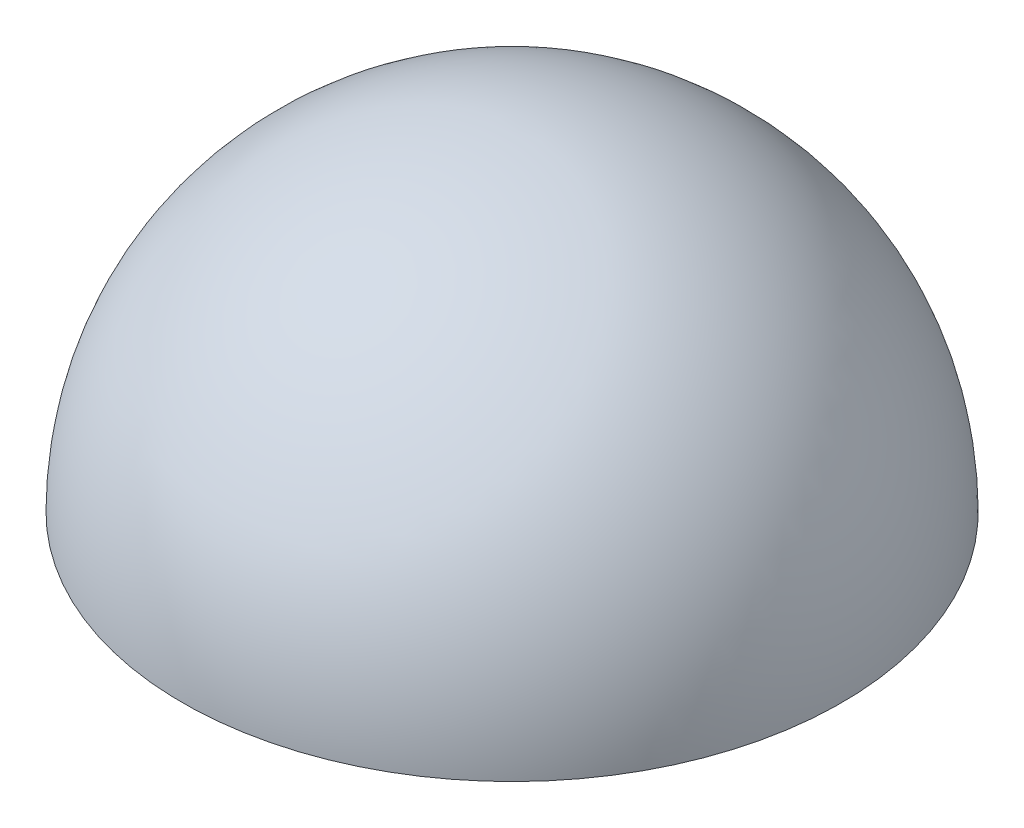
ISO-10303-21;
HEADER;
FILE_DESCRIPTION(('STEP AP214'),'2;1');
FILE_NAME('part.step','',(''),(''),'','','');
FILE_SCHEMA(('AUTOMOTIVE_DESIGN { 1 0 10303 214 1 1 1 1 }'));
ENDSEC;
DATA;
#1=APPLICATION_CONTEXT('core data for automotive mechanical design processes');
#2=APPLICATION_PROTOCOL_DEFINITION('international standard','automotive_design',2000,#1);
#3=PRODUCT_CONTEXT('',#1,'mechanical');
#4=PRODUCT('Part','Part','',(#3));
#5=PRODUCT_RELATED_PRODUCT_CATEGORY('part','',(#4));
#6=PRODUCT_DEFINITION_FORMATION('','',#4);
#7=PRODUCT_DEFINITION_CONTEXT('part definition',#1,'design');
#8=PRODUCT_DEFINITION('design','',#6,#7);
#9=PRODUCT_DEFINITION_SHAPE('','',#8);
#10=(LENGTH_UNIT() NAMED_UNIT(*) SI_UNIT(.MILLI.,.METRE.));
#11=(NAMED_UNIT(*) PLANE_ANGLE_UNIT() SI_UNIT($,.RADIAN.));
#12=(NAMED_UNIT(*) SI_UNIT($,.STERADIAN.) SOLID_ANGLE_UNIT());
#13=UNCERTAINTY_MEASURE_WITH_UNIT(LENGTH_MEASURE(1.E-05),#10,'distance_accuracy_value','');
#14=(GEOMETRIC_REPRESENTATION_CONTEXT(3) GLOBAL_UNCERTAINTY_ASSIGNED_CONTEXT((#13)) GLOBAL_UNIT_ASSIGNED_CONTEXT((#10,
#11,#12)) REPRESENTATION_CONTEXT('',''));
#15=CARTESIAN_POINT('',(0.,0.,0.));
#16=DIRECTION('',(0.,0.,1.));
#17=DIRECTION('',(1.,0.,0.));
#18=AXIS2_PLACEMENT_3D('',#15,#16,#17);
#19=CARTESIAN_POINT('',(0.,0.,0.));
#20=DIRECTION('',(-1.,0.,0.));
#21=DIRECTION('',(0.,0.,1.));
#22=AXIS2_PLACEMENT_3D('',#19,#20,#21);
#23=SPHERICAL_SURFACE('',#22,9.525);
#24=CARTESIAN_POINT('',(0.,0.,0.));
#25=DIRECTION('',(0.,-1.,0.));
#26=DIRECTION('',(0.,0.,-1.));
#27=AXIS2_PLACEMENT_3D('',#24,#25,#26);
#28=SPHERICAL_SURFACE('',#27,9.525);
#29=CARTESIAN_POINT('',(0.,0.,0.));
#30=DIRECTION('',(0.,-1.,0.));
#31=DIRECTION('',(0.,0.,-1.));
#32=AXIS2_PLACEMENT_3D('',#29,#30,#31);
#33=CIRCLE('',#32,9.525);
#34=CARTESIAN_POINT('',(0.,0.,-9.525));
#35=VERTEX_POINT('',#34);
#36=EDGE_CURVE('E10',#35,#35,#33,.F.);
#37=ORIENTED_EDGE('',*,*,#36,.T.);
#38=EDGE_LOOP('',(#37));
#39=FACE_BOUND('',#38,.T.);
#40=ADVANCED_FACE('F43',(#39),#28,.T.);
#41=CARTESIAN_POINT('',(0.,0.,0.));
#42=DIRECTION('',(0.,-1.,0.));
#43=DIRECTION('',(0.,0.,-1.));
#44=AXIS2_PLACEMENT_3D('',#41,#42,#43);
#45=PLANE('',#44);
#46=ORIENTED_EDGE('',*,*,#36,.F.);
#47=EDGE_LOOP('',(#46));
#48=FACE_BOUND('',#47,.T.);
#49=ADVANCED_FACE('F52',(#48),#45,.T.);
#50=CLOSED_SHELL('',(#40,#49));
#51=MANIFOLD_SOLID_BREP('B2',#50);
#52=ADVANCED_BREP_SHAPE_REPRESENTATION('',(#18,#51),#14);
#53=SHAPE_DEFINITION_REPRESENTATION(#9,#52);
ENDSEC;
END-ISO-10303-21;
